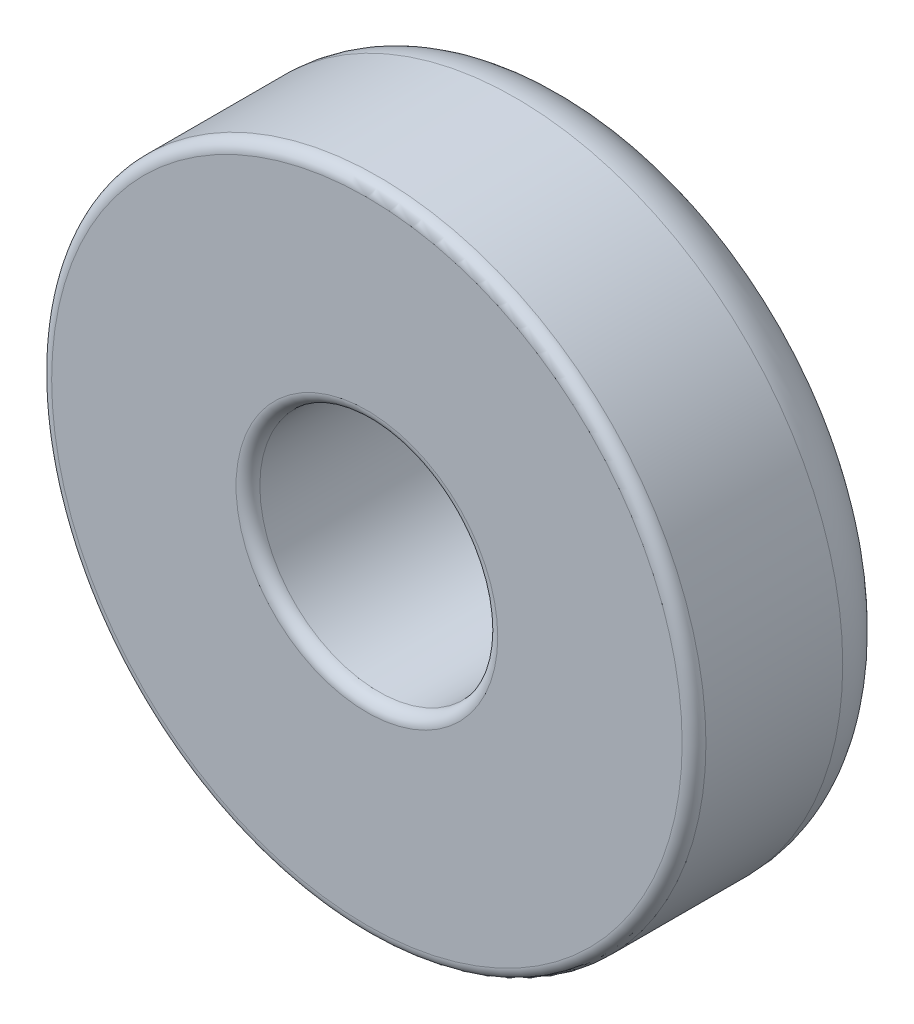
ISO-10303-21;
HEADER;
FILE_DESCRIPTION(('STEP AP214'),'2;1');
FILE_NAME('part.step','',(''),(''),'','','');
FILE_SCHEMA(('AUTOMOTIVE_DESIGN { 1 0 10303 214 1 1 1 1 }'));
ENDSEC;
DATA;
#1=APPLICATION_CONTEXT('core data for automotive mechanical design processes');
#2=APPLICATION_PROTOCOL_DEFINITION('international standard','automotive_design',2000,#1);
#3=PRODUCT_CONTEXT('',#1,'mechanical');
#4=PRODUCT('Part','Part','',(#3));
#5=PRODUCT_RELATED_PRODUCT_CATEGORY('part','',(#4));
#6=PRODUCT_DEFINITION_FORMATION('','',#4);
#7=PRODUCT_DEFINITION_CONTEXT('part definition',#1,'design');
#8=PRODUCT_DEFINITION('design','',#6,#7);
#9=PRODUCT_DEFINITION_SHAPE('','',#8);
#10=(LENGTH_UNIT() NAMED_UNIT(*) SI_UNIT(.MILLI.,.METRE.));
#11=(NAMED_UNIT(*) PLANE_ANGLE_UNIT() SI_UNIT($,.RADIAN.));
#12=(NAMED_UNIT(*) SI_UNIT($,.STERADIAN.) SOLID_ANGLE_UNIT());
#13=UNCERTAINTY_MEASURE_WITH_UNIT(LENGTH_MEASURE(1.E-05),#10,'distance_accuracy_value','');
#14=(GEOMETRIC_REPRESENTATION_CONTEXT(3) GLOBAL_UNCERTAINTY_ASSIGNED_CONTEXT((#13)) GLOBAL_UNIT_ASSIGNED_CONTEXT((#10,
#11,#12)) REPRESENTATION_CONTEXT('',''));
#15=CARTESIAN_POINT('',(0.,0.,0.));
#16=DIRECTION('',(0.,0.,1.));
#17=DIRECTION('',(1.,0.,0.));
#18=AXIS2_PLACEMENT_3D('',#15,#16,#17);
#19=CARTESIAN_POINT('',(0.,0.100943749346483,1.75));
#20=DIRECTION('',(0.,0.,1.));
#21=DIRECTION('',(1.,0.,0.));
#22=AXIS2_PLACEMENT_3D('',#19,#20,#21);
#23=PLANE('',#22);
#24=CARTESIAN_POINT('',(0.,0.100943749346483,1.75));
#25=DIRECTION('',(0.,0.,1.));
#26=DIRECTION('',(1.,0.,0.));
#27=AXIS2_PLACEMENT_3D('',#24,#25,#26);
#28=CIRCLE('',#27,1.1);
#29=CARTESIAN_POINT('',(1.1,0.100943749346483,1.75));
#30=VERTEX_POINT('',#29);
#31=EDGE_CURVE('E59',#30,#30,#28,.F.);
#32=ORIENTED_EDGE('',*,*,#31,.T.);
#33=EDGE_LOOP('',(#32));
#34=FACE_BOUND('',#33,.T.);
#35=CARTESIAN_POINT('',(0.,0.100943749346483,1.75));
#36=DIRECTION('',(0.,0.,1.));
#37=DIRECTION('',(1.,0.,0.));
#38=AXIS2_PLACEMENT_3D('',#35,#36,#37);
#39=CIRCLE('',#38,2.65);
#40=CARTESIAN_POINT('',(2.65,0.100943749346483,1.75));
#41=VERTEX_POINT('',#40);
#42=EDGE_CURVE('E64',#41,#41,#39,.T.);
#43=ORIENTED_EDGE('',*,*,#42,.T.);
#44=EDGE_LOOP('',(#43));
#45=FACE_BOUND('',#44,.T.);
#46=ADVANCED_FACE('F46',(#34,#45),#23,.T.);
#47=CARTESIAN_POINT('',(0.,0.100943749346483,0.));
#48=DIRECTION('',(0.,0.,1.));
#49=DIRECTION('',(1.,0.,0.));
#50=AXIS2_PLACEMENT_3D('',#47,#48,#49);
#51=PLANE('',#50);
#52=CARTESIAN_POINT('',(0.,0.100943749346483,0.));
#53=DIRECTION('',(0.,0.,1.));
#54=DIRECTION('',(1.,0.,0.));
#55=AXIS2_PLACEMENT_3D('',#52,#53,#54);
#56=CIRCLE('',#55,1.1);
#57=CARTESIAN_POINT('',(1.1,0.100943749346483,0.));
#58=VERTEX_POINT('',#57);
#59=EDGE_CURVE('E11',#58,#58,#56,.T.);
#60=ORIENTED_EDGE('',*,*,#59,.T.);
#61=EDGE_LOOP('',(#60));
#62=FACE_BOUND('',#61,.T.);
#63=CARTESIAN_POINT('',(0.,0.100943749346483,0.));
#64=DIRECTION('',(0.,0.,1.));
#65=DIRECTION('',(1.,0.,0.));
#66=AXIS2_PLACEMENT_3D('',#63,#64,#65);
#67=CIRCLE('',#66,2.25);
#68=CARTESIAN_POINT('',(2.25,0.100943749346483,0.));
#69=VERTEX_POINT('',#68);
#70=EDGE_CURVE('E78',#69,#69,#67,.F.);
#71=ORIENTED_EDGE('',*,*,#70,.T.);
#72=EDGE_LOOP('',(#71));
#73=FACE_BOUND('',#72,.T.);
#74=ADVANCED_FACE('F107',(#62,#73),#51,.F.);
#75=CARTESIAN_POINT('',(0.,0.100943749346483,1.75));
#76=DIRECTION('',(0.,0.,-1.));
#77=DIRECTION('',(-1.,0.,0.));
#78=AXIS2_PLACEMENT_3D('',#75,#76,#77);
#79=CYLINDRICAL_SURFACE('',#78,2.75);
#80=CARTESIAN_POINT('',(0.,0.100943749346483,1.65));
#81=DIRECTION('',(0.,0.,1.));
#82=DIRECTION('',(1.,0.,0.));
#83=AXIS2_PLACEMENT_3D('',#80,#81,#82);
#84=CIRCLE('',#83,2.75);
#85=CARTESIAN_POINT('',(2.75,0.100943749346483,1.65));
#86=VERTEX_POINT('',#85);
#87=EDGE_CURVE('E54',#86,#86,#84,.F.);
#88=ORIENTED_EDGE('',*,*,#87,.T.);
#89=EDGE_LOOP('',(#88));
#90=FACE_BOUND('',#89,.T.);
#91=CARTESIAN_POINT('',(0.,0.100943749346483,0.5));
#92=DIRECTION('',(0.,0.,1.));
#93=DIRECTION('',(1.,0.,0.));
#94=AXIS2_PLACEMENT_3D('',#91,#92,#93);
#95=CIRCLE('',#94,2.75);
#96=CARTESIAN_POINT('',(2.75,0.100943749346483,0.5));
#97=VERTEX_POINT('',#96);
#98=EDGE_CURVE('E82',#97,#97,#95,.T.);
#99=ORIENTED_EDGE('',*,*,#98,.T.);
#100=EDGE_LOOP('',(#99));
#101=FACE_BOUND('',#100,.T.);
#102=ADVANCED_FACE('F87',(#90,#101),#79,.T.);
#103=CARTESIAN_POINT('',(0.,0.100943749346483,1.75));
#104=DIRECTION('',(0.,0.,-1.));
#105=DIRECTION('',(-1.,0.,0.));
#106=AXIS2_PLACEMENT_3D('',#103,#104,#105);
#107=CYLINDRICAL_SURFACE('',#106,1.);
#108=CARTESIAN_POINT('',(0.,0.100943749346483,1.65));
#109=DIRECTION('',(0.,0.,1.));
#110=DIRECTION('',(1.,0.,0.));
#111=AXIS2_PLACEMENT_3D('',#108,#109,#110);
#112=CIRCLE('',#111,1.);
#113=CARTESIAN_POINT('',(1.,0.100943749346483,1.65));
#114=VERTEX_POINT('',#113);
#115=EDGE_CURVE('E70',#114,#114,#112,.T.);
#116=ORIENTED_EDGE('',*,*,#115,.T.);
#117=EDGE_LOOP('',(#116));
#118=FACE_BOUND('',#117,.T.);
#119=CARTESIAN_POINT('',(0.,0.100943749346483,0.1));
#120=DIRECTION('',(0.,0.,1.));
#121=DIRECTION('',(1.,0.,0.));
#122=AXIS2_PLACEMENT_3D('',#119,#120,#121);
#123=CIRCLE('',#122,1.);
#124=CARTESIAN_POINT('',(1.,0.100943749346483,0.1));
#125=VERTEX_POINT('',#124);
#126=EDGE_CURVE('E74',#125,#125,#123,.F.);
#127=ORIENTED_EDGE('',*,*,#126,.T.);
#128=EDGE_LOOP('',(#127));
#129=FACE_BOUND('',#128,.T.);
#130=ADVANCED_FACE('F92',(#118,#129),#107,.F.);
#131=CARTESIAN_POINT('',(0.,0.100943749346483,0.5));
#132=DIRECTION('',(0.,0.,1.));
#133=DIRECTION('',(1.,0.,0.));
#134=AXIS2_PLACEMENT_3D('',#131,#132,#133);
#135=TOROIDAL_SURFACE('',#134,2.25,0.5);
#136=ORIENTED_EDGE('',*,*,#70,.F.);
#137=EDGE_LOOP('',(#136));
#138=FACE_BOUND('',#137,.T.);
#139=ORIENTED_EDGE('',*,*,#98,.F.);
#140=EDGE_LOOP('',(#139));
#141=FACE_BOUND('',#140,.T.);
#142=ADVANCED_FACE('F89',(#138,#141),#135,.T.);
#143=CARTESIAN_POINT('',(0.,0.100943749346483,1.65));
#144=DIRECTION('',(0.,0.,1.));
#145=DIRECTION('',(1.,0.,0.));
#146=AXIS2_PLACEMENT_3D('',#143,#144,#145);
#147=TOROIDAL_SURFACE('',#146,1.1,0.1);
#148=ORIENTED_EDGE('',*,*,#31,.F.);
#149=EDGE_LOOP('',(#148));
#150=FACE_BOUND('',#149,.T.);
#151=ORIENTED_EDGE('',*,*,#115,.F.);
#152=EDGE_LOOP('',(#151));
#153=FACE_BOUND('',#152,.T.);
#154=ADVANCED_FACE('F91',(#150,#153),#147,.T.);
#155=CARTESIAN_POINT('',(0.,0.100943749346483,1.65));
#156=DIRECTION('',(0.,0.,1.));
#157=DIRECTION('',(1.,0.,0.));
#158=AXIS2_PLACEMENT_3D('',#155,#156,#157);
#159=TOROIDAL_SURFACE('',#158,2.65,0.1);
#160=ORIENTED_EDGE('',*,*,#87,.F.);
#161=EDGE_LOOP('',(#160));
#162=FACE_BOUND('',#161,.T.);
#163=ORIENTED_EDGE('',*,*,#42,.F.);
#164=EDGE_LOOP('',(#163));
#165=FACE_BOUND('',#164,.T.);
#166=ADVANCED_FACE('F99',(#162,#165),#159,.T.);
#167=CARTESIAN_POINT('',(0.,0.100943749346483,0.1));
#168=DIRECTION('',(0.,0.,1.));
#169=DIRECTION('',(1.,0.,0.));
#170=AXIS2_PLACEMENT_3D('',#167,#168,#169);
#171=TOROIDAL_SURFACE('',#170,1.1,0.1);
#172=ORIENTED_EDGE('',*,*,#126,.F.);
#173=EDGE_LOOP('',(#172));
#174=FACE_BOUND('',#173,.T.);
#175=ORIENTED_EDGE('',*,*,#59,.F.);
#176=EDGE_LOOP('',(#175));
#177=FACE_BOUND('',#176,.T.);
#178=ADVANCED_FACE('F48',(#174,#177),#171,.T.);
#179=CLOSED_SHELL('',(#46,#74,#102,#130,#142,#154,#166,#178));
#180=MANIFOLD_SOLID_BREP('B2',#179);
#181=ADVANCED_BREP_SHAPE_REPRESENTATION('',(#18,#180),#14);
#182=SHAPE_DEFINITION_REPRESENTATION(#9,#181);
ENDSEC;
END-ISO-10303-21;
